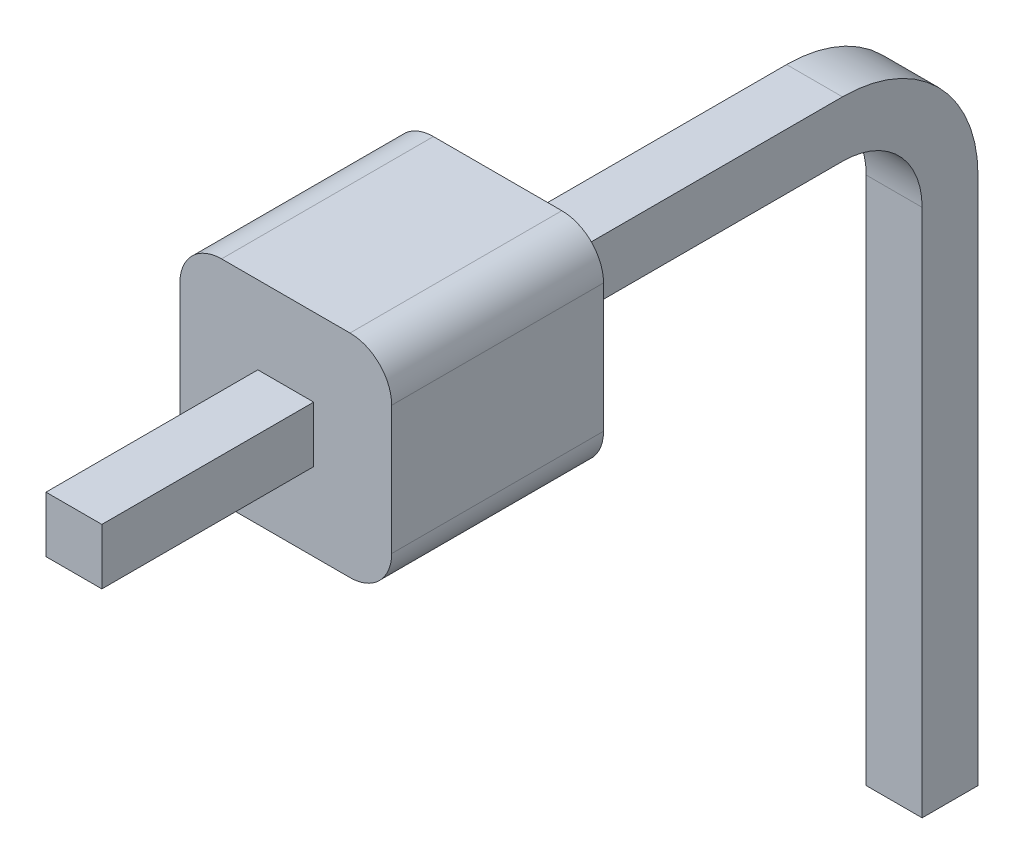
ISO-10303-21;
HEADER;
FILE_DESCRIPTION(('STEP AP214'),'2;1');
FILE_NAME('part.step','',(''),(''),'','','');
FILE_SCHEMA(('AUTOMOTIVE_DESIGN { 1 0 10303 214 1 1 1 1 }'));
ENDSEC;
DATA;
#1=APPLICATION_CONTEXT('core data for automotive mechanical design processes');
#2=APPLICATION_PROTOCOL_DEFINITION('international standard','automotive_design',2000,#1);
#3=PRODUCT_CONTEXT('',#1,'mechanical');
#4=PRODUCT('Part','Part','',(#3));
#5=PRODUCT_RELATED_PRODUCT_CATEGORY('part','',(#4));
#6=PRODUCT_DEFINITION_FORMATION('','',#4);
#7=PRODUCT_DEFINITION_CONTEXT('part definition',#1,'design');
#8=PRODUCT_DEFINITION('design','',#6,#7);
#9=PRODUCT_DEFINITION_SHAPE('','',#8);
#10=(LENGTH_UNIT() NAMED_UNIT(*) SI_UNIT(.MILLI.,.METRE.));
#11=(NAMED_UNIT(*) PLANE_ANGLE_UNIT() SI_UNIT($,.RADIAN.));
#12=(NAMED_UNIT(*) SI_UNIT($,.STERADIAN.) SOLID_ANGLE_UNIT());
#13=UNCERTAINTY_MEASURE_WITH_UNIT(LENGTH_MEASURE(1.E-05),#10,'distance_accuracy_value','');
#14=(GEOMETRIC_REPRESENTATION_CONTEXT(3) GLOBAL_UNCERTAINTY_ASSIGNED_CONTEXT((#13)) GLOBAL_UNIT_ASSIGNED_CONTEXT((#10,
#11,#12)) REPRESENTATION_CONTEXT('',''));
#15=CARTESIAN_POINT('',(0.,0.,0.));
#16=DIRECTION('',(0.,0.,1.));
#17=DIRECTION('',(1.,0.,0.));
#18=AXIS2_PLACEMENT_3D('',#15,#16,#17);
#19=CARTESIAN_POINT('',(-1.27,-0.0190907262086213,2.54));
#20=DIRECTION('',(0.,0.,1.));
#21=DIRECTION('',(1.,0.,0.));
#22=AXIS2_PLACEMENT_3D('',#19,#20,#21);
#23=PLANE('',#22);
#24=DIRECTION('',(1.,0.,0.));
#25=VECTOR('',#24,1.);
#26=CARTESIAN_POINT('',(-1.27,-2.55909072620862,2.54));
#27=LINE('',#26,#25);
#28=CARTESIAN_POINT('',(-0.769999999999999,-2.55909072620862,2.54));
#29=VERTEX_POINT('',#28);
#30=CARTESIAN_POINT('',(0.770000000000001,-2.55909072620862,2.54));
#31=VERTEX_POINT('',#30);
#32=EDGE_CURVE('E262',#29,#31,#27,.T.);
#33=ORIENTED_EDGE('',*,*,#32,.T.);
#34=CARTESIAN_POINT('',(0.770000000000001,-2.05909072620862,2.54));
#35=DIRECTION('',(0.,0.,1.));
#36=DIRECTION('',(1.,0.,0.));
#37=AXIS2_PLACEMENT_3D('',#34,#35,#36);
#38=CIRCLE('',#37,0.5);
#39=CARTESIAN_POINT('',(1.27,-2.05909072620862,2.54));
#40=VERTEX_POINT('',#39);
#41=EDGE_CURVE('E301',#31,#40,#38,.T.);
#42=ORIENTED_EDGE('',*,*,#41,.T.);
#43=DIRECTION('',(0.,1.,0.));
#44=VECTOR('',#43,1.);
#45=CARTESIAN_POINT('',(1.27,-0.019090726208621,2.54));
#46=LINE('',#45,#44);
#47=CARTESIAN_POINT('',(1.27,-0.519090726208621,2.54));
#48=VERTEX_POINT('',#47);
#49=EDGE_CURVE('E265',#40,#48,#46,.T.);
#50=ORIENTED_EDGE('',*,*,#49,.T.);
#51=CARTESIAN_POINT('',(0.770000000000001,-0.519090726208621,2.54));
#52=DIRECTION('',(0.,0.,1.));
#53=DIRECTION('',(1.,0.,0.));
#54=AXIS2_PLACEMENT_3D('',#51,#52,#53);
#55=CIRCLE('',#54,0.5);
#56=CARTESIAN_POINT('',(0.770000000000001,-0.019090726208621,2.54));
#57=VERTEX_POINT('',#56);
#58=EDGE_CURVE('E52',#48,#57,#55,.T.);
#59=ORIENTED_EDGE('',*,*,#58,.T.);
#60=DIRECTION('',(-1.,0.,0.));
#61=VECTOR('',#60,1.);
#62=CARTESIAN_POINT('',(-1.27,-0.0190907262086213,2.54));
#63=LINE('',#62,#61);
#64=CARTESIAN_POINT('',(-0.77,-0.0190907262086212,2.54));
#65=VERTEX_POINT('',#64);
#66=EDGE_CURVE('E267',#57,#65,#63,.T.);
#67=ORIENTED_EDGE('',*,*,#66,.T.);
#68=CARTESIAN_POINT('',(-0.769999999999999,-0.519090726208621,2.54));
#69=DIRECTION('',(0.,0.,1.));
#70=DIRECTION('',(1.,0.,0.));
#71=AXIS2_PLACEMENT_3D('',#68,#69,#70);
#72=CIRCLE('',#71,0.5);
#73=CARTESIAN_POINT('',(-1.27,-0.519090726208621,2.54));
#74=VERTEX_POINT('',#73);
#75=EDGE_CURVE('E297',#65,#74,#72,.T.);
#76=ORIENTED_EDGE('',*,*,#75,.T.);
#77=DIRECTION('',(0.,-1.,0.));
#78=VECTOR('',#77,1.);
#79=CARTESIAN_POINT('',(-1.27,-0.0190907262086213,2.54));
#80=LINE('',#79,#78);
#81=CARTESIAN_POINT('',(-1.27,-2.05909072620862,2.54));
#82=VERTEX_POINT('',#81);
#83=EDGE_CURVE('E259',#74,#82,#80,.T.);
#84=ORIENTED_EDGE('',*,*,#83,.T.);
#85=CARTESIAN_POINT('',(-0.769999999999999,-2.05909072620862,2.54));
#86=DIRECTION('',(0.,0.,1.));
#87=DIRECTION('',(1.,0.,0.));
#88=AXIS2_PLACEMENT_3D('',#85,#86,#87);
#89=CIRCLE('',#88,0.5);
#90=EDGE_CURVE('E299',#82,#29,#89,.T.);
#91=ORIENTED_EDGE('',*,*,#90,.T.);
#92=EDGE_LOOP('',(#33,#42,#50,#59,#67,#76,#84,#91));
#93=FACE_BOUND('',#92,.T.);
#94=DIRECTION('',(1.,0.,0.));
#95=VECTOR('',#94,1.);
#96=CARTESIAN_POINT('',(-1.27,-0.954090726208621,2.54));
#97=LINE('',#96,#95);
#98=CARTESIAN_POINT('',(-0.335,-0.954090726208621,2.54));
#99=VERTEX_POINT('',#98);
#100=CARTESIAN_POINT('',(0.335,-0.954090726208621,2.54));
#101=VERTEX_POINT('',#100);
#102=EDGE_CURVE('E236',#99,#101,#97,.T.);
#103=ORIENTED_EDGE('',*,*,#102,.T.);
#104=DIRECTION('',(0.,-1.,0.));
#105=VECTOR('',#104,1.);
#106=CARTESIAN_POINT('',(0.335000000000001,-0.0190907262086233,2.54));
#107=LINE('',#106,#105);
#108=CARTESIAN_POINT('',(0.334999999999999,-1.62409072620862,2.54));
#109=VERTEX_POINT('',#108);
#110=EDGE_CURVE('E245',#101,#109,#107,.T.);
#111=ORIENTED_EDGE('',*,*,#110,.T.);
#112=DIRECTION('',(-1.,0.,0.));
#113=VECTOR('',#112,1.);
#114=CARTESIAN_POINT('',(-1.27,-1.62409072620862,2.54));
#115=LINE('',#114,#113);
#116=CARTESIAN_POINT('',(-0.335,-1.62409072620862,2.54));
#117=VERTEX_POINT('',#116);
#118=EDGE_CURVE('E242',#109,#117,#115,.T.);
#119=ORIENTED_EDGE('',*,*,#118,.T.);
#120=DIRECTION('',(0.,1.,0.));
#121=VECTOR('',#120,1.);
#122=CARTESIAN_POINT('',(-0.335,-0.0190907262086213,2.54));
#123=LINE('',#122,#121);
#124=EDGE_CURVE('E239',#117,#99,#123,.T.);
#125=ORIENTED_EDGE('',*,*,#124,.T.);
#126=EDGE_LOOP('',(#103,#111,#119,#125));
#127=FACE_BOUND('',#126,.T.);
#128=ADVANCED_FACE('F32',(#93,#127),#23,.T.);
#129=CARTESIAN_POINT('',(-1.27,-0.0190907262086213,0.));
#130=DIRECTION('',(0.,0.,1.));
#131=DIRECTION('',(1.,0.,0.));
#132=AXIS2_PLACEMENT_3D('',#129,#130,#131);
#133=PLANE('',#132);
#134=DIRECTION('',(0.,1.,0.));
#135=VECTOR('',#134,1.);
#136=CARTESIAN_POINT('',(1.27,-0.019090726208621,0.));
#137=LINE('',#136,#135);
#138=CARTESIAN_POINT('',(1.27,-2.05909072620862,0.));
#139=VERTEX_POINT('',#138);
#140=CARTESIAN_POINT('',(1.27,-0.519090726208621,0.));
#141=VERTEX_POINT('',#140);
#142=EDGE_CURVE('E254',#139,#141,#137,.T.);
#143=ORIENTED_EDGE('',*,*,#142,.F.);
#144=CARTESIAN_POINT('',(0.770000000000001,-2.05909072620862,0.));
#145=DIRECTION('',(0.,0.,1.));
#146=DIRECTION('',(1.,0.,0.));
#147=AXIS2_PLACEMENT_3D('',#144,#145,#146);
#148=CIRCLE('',#147,0.5);
#149=CARTESIAN_POINT('',(0.770000000000001,-2.55909072620862,0.));
#150=VERTEX_POINT('',#149);
#151=EDGE_CURVE('E289',#139,#150,#148,.F.);
#152=ORIENTED_EDGE('',*,*,#151,.T.);
#153=DIRECTION('',(1.,0.,0.));
#154=VECTOR('',#153,1.);
#155=CARTESIAN_POINT('',(-1.27,-2.55909072620862,0.));
#156=LINE('',#155,#154);
#157=CARTESIAN_POINT('',(-0.769999999999999,-2.55909072620862,0.));
#158=VERTEX_POINT('',#157);
#159=EDGE_CURVE('E251',#158,#150,#156,.T.);
#160=ORIENTED_EDGE('',*,*,#159,.F.);
#161=CARTESIAN_POINT('',(-0.769999999999999,-2.05909072620862,0.));
#162=DIRECTION('',(0.,0.,1.));
#163=DIRECTION('',(1.,0.,0.));
#164=AXIS2_PLACEMENT_3D('',#161,#162,#163);
#165=CIRCLE('',#164,0.5);
#166=CARTESIAN_POINT('',(-1.27,-2.05909072620862,0.));
#167=VERTEX_POINT('',#166);
#168=EDGE_CURVE('E287',#158,#167,#165,.F.);
#169=ORIENTED_EDGE('',*,*,#168,.T.);
#170=DIRECTION('',(0.,-1.,0.));
#171=VECTOR('',#170,1.);
#172=CARTESIAN_POINT('',(-1.27,-0.0190907262086213,0.));
#173=LINE('',#172,#171);
#174=CARTESIAN_POINT('',(-1.27,-0.519090726208621,0.));
#175=VERTEX_POINT('',#174);
#176=EDGE_CURVE('E248',#175,#167,#173,.T.);
#177=ORIENTED_EDGE('',*,*,#176,.F.);
#178=CARTESIAN_POINT('',(-0.769999999999999,-0.519090726208621,0.));
#179=DIRECTION('',(0.,0.,1.));
#180=DIRECTION('',(1.,0.,0.));
#181=AXIS2_PLACEMENT_3D('',#178,#179,#180);
#182=CIRCLE('',#181,0.5);
#183=CARTESIAN_POINT('',(-0.77,-0.0190907262086212,0.));
#184=VERTEX_POINT('',#183);
#185=EDGE_CURVE('E285',#175,#184,#182,.F.);
#186=ORIENTED_EDGE('',*,*,#185,.T.);
#187=DIRECTION('',(-1.,0.,0.));
#188=VECTOR('',#187,1.);
#189=CARTESIAN_POINT('',(-1.27,-0.0190907262086213,0.));
#190=LINE('',#189,#188);
#191=CARTESIAN_POINT('',(0.770000000000001,-0.019090726208621,0.));
#192=VERTEX_POINT('',#191);
#193=EDGE_CURVE('E257',#192,#184,#190,.T.);
#194=ORIENTED_EDGE('',*,*,#193,.F.);
#195=CARTESIAN_POINT('',(0.770000000000001,-0.519090726208621,0.));
#196=DIRECTION('',(0.,0.,1.));
#197=DIRECTION('',(1.,0.,0.));
#198=AXIS2_PLACEMENT_3D('',#195,#196,#197);
#199=CIRCLE('',#198,0.5);
#200=EDGE_CURVE('E283',#192,#141,#199,.F.);
#201=ORIENTED_EDGE('',*,*,#200,.T.);
#202=EDGE_LOOP('',(#143,#152,#160,#169,#177,#186,#194,#201));
#203=FACE_BOUND('',#202,.T.);
#204=DIRECTION('',(0.,-1.,0.));
#205=VECTOR('',#204,1.);
#206=CARTESIAN_POINT('',(0.335000000000001,-0.0190907262086233,0.));
#207=LINE('',#206,#205);
#208=CARTESIAN_POINT('',(0.335,-0.954090726208621,0.));
#209=VERTEX_POINT('',#208);
#210=CARTESIAN_POINT('',(0.334999999999999,-1.62409072620862,0.));
#211=VERTEX_POINT('',#210);
#212=EDGE_CURVE('E197',#209,#211,#207,.T.);
#213=ORIENTED_EDGE('',*,*,#212,.F.);
#214=DIRECTION('',(1.,0.,0.));
#215=VECTOR('',#214,1.);
#216=CARTESIAN_POINT('',(-1.27,-0.95409072620862,0.));
#217=LINE('',#216,#215);
#218=CARTESIAN_POINT('',(-0.335,-0.954090726208621,0.));
#219=VERTEX_POINT('',#218);
#220=EDGE_CURVE('E269',#219,#209,#217,.T.);
#221=ORIENTED_EDGE('',*,*,#220,.F.);
#222=DIRECTION('',(0.,1.,0.));
#223=VECTOR('',#222,1.);
#224=CARTESIAN_POINT('',(-0.335,-0.0190907262086213,0.));
#225=LINE('',#224,#223);
#226=CARTESIAN_POINT('',(-0.335,-1.62409072620862,0.));
#227=VERTEX_POINT('',#226);
#228=EDGE_CURVE('E272',#227,#219,#225,.T.);
#229=ORIENTED_EDGE('',*,*,#228,.F.);
#230=DIRECTION('',(-1.,0.,0.));
#231=VECTOR('',#230,1.);
#232=CARTESIAN_POINT('',(-1.27,-1.62409072620862,0.));
#233=LINE('',#232,#231);
#234=EDGE_CURVE('E275',#211,#227,#233,.T.);
#235=ORIENTED_EDGE('',*,*,#234,.F.);
#236=EDGE_LOOP('',(#213,#221,#229,#235));
#237=FACE_BOUND('',#236,.T.);
#238=ADVANCED_FACE('F314',(#203,#237),#133,.F.);
#239=CARTESIAN_POINT('',(-1.27,-0.0190907262086213,2.54));
#240=DIRECTION('',(1.,0.,0.));
#241=DIRECTION('',(0.,0.,-1.));
#242=AXIS2_PLACEMENT_3D('',#239,#240,#241);
#243=PLANE('',#242);
#244=ORIENTED_EDGE('',*,*,#176,.T.);
#245=DIRECTION('',(0.,0.,-1.));
#246=VECTOR('',#245,1.);
#247=CARTESIAN_POINT('',(-1.27,-2.05909072620862,2.54));
#248=LINE('',#247,#246);
#249=EDGE_CURVE('E306',#167,#82,#248,.F.);
#250=ORIENTED_EDGE('',*,*,#249,.T.);
#251=ORIENTED_EDGE('',*,*,#83,.F.);
#252=DIRECTION('',(0.,0.,-1.));
#253=VECTOR('',#252,1.);
#254=CARTESIAN_POINT('',(-1.27,-0.519090726208621,2.54));
#255=LINE('',#254,#253);
#256=EDGE_CURVE('E303',#74,#175,#255,.T.);
#257=ORIENTED_EDGE('',*,*,#256,.T.);
#258=EDGE_LOOP('',(#244,#250,#251,#257));
#259=FACE_BOUND('',#258,.T.);
#260=ADVANCED_FACE('F323',(#259),#243,.F.);
#261=CARTESIAN_POINT('',(-1.27,-2.55909072620862,2.54));
#262=DIRECTION('',(0.,1.,0.));
#263=DIRECTION('',(-1.,0.,0.));
#264=AXIS2_PLACEMENT_3D('',#261,#262,#263);
#265=PLANE('',#264);
#266=ORIENTED_EDGE('',*,*,#159,.T.);
#267=DIRECTION('',(0.,0.,-1.));
#268=VECTOR('',#267,1.);
#269=CARTESIAN_POINT('',(0.770000000000001,-2.55909072620862,2.54));
#270=LINE('',#269,#268);
#271=EDGE_CURVE('E294',#150,#31,#270,.F.);
#272=ORIENTED_EDGE('',*,*,#271,.T.);
#273=ORIENTED_EDGE('',*,*,#32,.F.);
#274=DIRECTION('',(0.,0.,-1.));
#275=VECTOR('',#274,1.);
#276=CARTESIAN_POINT('',(-0.769999999999999,-2.55909072620862,2.54));
#277=LINE('',#276,#275);
#278=EDGE_CURVE('E291',#29,#158,#277,.T.);
#279=ORIENTED_EDGE('',*,*,#278,.T.);
#280=EDGE_LOOP('',(#266,#272,#273,#279));
#281=FACE_BOUND('',#280,.T.);
#282=ADVANCED_FACE('F333',(#281),#265,.F.);
#283=CARTESIAN_POINT('',(1.27,-0.019090726208621,2.54));
#284=DIRECTION('',(-1.,0.,0.));
#285=DIRECTION('',(0.,0.,1.));
#286=AXIS2_PLACEMENT_3D('',#283,#284,#285);
#287=PLANE('',#286);
#288=ORIENTED_EDGE('',*,*,#49,.F.);
#289=DIRECTION('',(0.,0.,-1.));
#290=VECTOR('',#289,1.);
#291=CARTESIAN_POINT('',(1.27,-2.05909072620862,2.54));
#292=LINE('',#291,#290);
#293=EDGE_CURVE('E280',#40,#139,#292,.T.);
#294=ORIENTED_EDGE('',*,*,#293,.T.);
#295=ORIENTED_EDGE('',*,*,#142,.T.);
#296=DIRECTION('',(0.,0.,-1.));
#297=VECTOR('',#296,1.);
#298=CARTESIAN_POINT('',(1.27,-0.519090726208621,2.54));
#299=LINE('',#298,#297);
#300=EDGE_CURVE('E278',#141,#48,#299,.F.);
#301=ORIENTED_EDGE('',*,*,#300,.T.);
#302=EDGE_LOOP('',(#288,#294,#295,#301));
#303=FACE_BOUND('',#302,.T.);
#304=ADVANCED_FACE('F341',(#303),#287,.F.);
#305=CARTESIAN_POINT('',(-1.27,-0.0190907262086213,2.54));
#306=DIRECTION('',(0.,-1.,0.));
#307=DIRECTION('',(1.,0.,0.));
#308=AXIS2_PLACEMENT_3D('',#305,#306,#307);
#309=PLANE('',#308);
#310=ORIENTED_EDGE('',*,*,#193,.T.);
#311=DIRECTION('',(0.,0.,-1.));
#312=VECTOR('',#311,1.);
#313=CARTESIAN_POINT('',(-0.77,-0.0190907262086212,2.54));
#314=LINE('',#313,#312);
#315=EDGE_CURVE('E11',#184,#65,#314,.F.);
#316=ORIENTED_EDGE('',*,*,#315,.T.);
#317=ORIENTED_EDGE('',*,*,#66,.F.);
#318=DIRECTION('',(0.,0.,-1.));
#319=VECTOR('',#318,1.);
#320=CARTESIAN_POINT('',(0.770000000000001,-0.019090726208621,2.54));
#321=LINE('',#320,#319);
#322=EDGE_CURVE('E40',#57,#192,#321,.T.);
#323=ORIENTED_EDGE('',*,*,#322,.T.);
#324=EDGE_LOOP('',(#310,#316,#317,#323));
#325=FACE_BOUND('',#324,.T.);
#326=ADVANCED_FACE('F310',(#325),#309,.F.);
#327=CARTESIAN_POINT('',(0.,-2.57909072620862,-3.8));
#328=DIRECTION('',(-1.,0.,0.));
#329=DIRECTION('',(0.,0.,1.));
#330=AXIS2_PLACEMENT_3D('',#327,#328,#329);
#331=CYLINDRICAL_SURFACE('',#330,0.955000000000001);
#332=DIRECTION('',(-1.,0.,0.));
#333=VECTOR('',#332,1.);
#334=CARTESIAN_POINT('',(0.334999999999999,-1.62409072620862,-3.8));
#335=LINE('',#334,#333);
#336=CARTESIAN_POINT('',(0.334999999999999,-1.62409072620862,-3.8));
#337=VERTEX_POINT('',#336);
#338=CARTESIAN_POINT('',(-0.335,-1.62409072620862,-3.8));
#339=VERTEX_POINT('',#338);
#340=EDGE_CURVE('E174',#337,#339,#335,.T.);
#341=ORIENTED_EDGE('',*,*,#340,.T.);
#342=CARTESIAN_POINT('',(-0.335,-2.57909072620862,-3.8));
#343=DIRECTION('',(-1.,0.,0.));
#344=DIRECTION('',(0.,0.,1.));
#345=AXIS2_PLACEMENT_3D('',#342,#343,#344);
#346=CIRCLE('',#345,0.955000000000001);
#347=CARTESIAN_POINT('',(-0.335,-2.57909072620862,-4.755));
#348=VERTEX_POINT('',#347);
#349=EDGE_CURVE('E182',#339,#348,#346,.T.);
#350=ORIENTED_EDGE('',*,*,#349,.T.);
#351=DIRECTION('',(-1.,0.,0.));
#352=VECTOR('',#351,1.);
#353=CARTESIAN_POINT('',(0.334999999999999,-2.57909072620862,-4.755));
#354=LINE('',#353,#352);
#355=CARTESIAN_POINT('',(0.334999999999999,-2.57909072620862,-4.755));
#356=VERTEX_POINT('',#355);
#357=EDGE_CURVE('E177',#356,#348,#354,.T.);
#358=ORIENTED_EDGE('',*,*,#357,.F.);
#359=CARTESIAN_POINT('',(0.334999999999999,-2.57909072620862,-3.8));
#360=DIRECTION('',(-1.,0.,0.));
#361=DIRECTION('',(0.,0.,1.));
#362=AXIS2_PLACEMENT_3D('',#359,#360,#361);
#363=CIRCLE('',#362,0.955000000000001);
#364=EDGE_CURVE('E170',#337,#356,#363,.T.);
#365=ORIENTED_EDGE('',*,*,#364,.F.);
#366=EDGE_LOOP('',(#341,#350,#358,#365));
#367=FACE_BOUND('',#366,.T.);
#368=ADVANCED_FACE('F172',(#367),#331,.F.);
#369=CARTESIAN_POINT('',(0.334999999999999,-2.57909072620862,-4.755));
#370=DIRECTION('',(0.,0.,1.));
#371=DIRECTION('',(0.,-1.,0.));
#372=AXIS2_PLACEMENT_3D('',#369,#370,#371);
#373=PLANE('',#372);
#374=ORIENTED_EDGE('',*,*,#357,.T.);
#375=DIRECTION('',(0.,-1.,0.));
#376=VECTOR('',#375,1.);
#377=CARTESIAN_POINT('',(-0.335,-2.57909072620862,-4.755));
#378=LINE('',#377,#376);
#379=CARTESIAN_POINT('',(-0.335,-8.91909072620862,-4.755));
#380=VERTEX_POINT('',#379);
#381=EDGE_CURVE('E231',#348,#380,#378,.T.);
#382=ORIENTED_EDGE('',*,*,#381,.T.);
#383=DIRECTION('',(-1.,0.,0.));
#384=VECTOR('',#383,1.);
#385=CARTESIAN_POINT('',(0.334999999999999,-8.91909072620862,-4.755));
#386=LINE('',#385,#384);
#387=CARTESIAN_POINT('',(0.334999999999999,-8.91909072620862,-4.755));
#388=VERTEX_POINT('',#387);
#389=EDGE_CURVE('E222',#388,#380,#386,.T.);
#390=ORIENTED_EDGE('',*,*,#389,.F.);
#391=DIRECTION('',(0.,-1.,0.));
#392=VECTOR('',#391,1.);
#393=CARTESIAN_POINT('',(0.334999999999999,-2.57909072620862,-4.755));
#394=LINE('',#393,#392);
#395=EDGE_CURVE('E234',#356,#388,#394,.T.);
#396=ORIENTED_EDGE('',*,*,#395,.F.);
#397=EDGE_LOOP('',(#374,#382,#390,#396));
#398=FACE_BOUND('',#397,.T.);
#399=ADVANCED_FACE('F505',(#398),#373,.T.);
#400=CARTESIAN_POINT('',(0.335,-8.91909072620862,-5.425));
#401=DIRECTION('',(0.,-1.,0.));
#402=DIRECTION('',(-1.,0.,0.));
#403=AXIS2_PLACEMENT_3D('',#400,#401,#402);
#404=PLANE('',#403);
#405=DIRECTION('',(0.,0.,1.));
#406=VECTOR('',#405,1.);
#407=CARTESIAN_POINT('',(0.335,-8.91909072620862,-5.425));
#408=LINE('',#407,#406);
#409=CARTESIAN_POINT('',(0.335,-8.91909072620862,-5.425));
#410=VERTEX_POINT('',#409);
#411=EDGE_CURVE('E181',#410,#388,#408,.T.);
#412=ORIENTED_EDGE('',*,*,#411,.T.);
#413=ORIENTED_EDGE('',*,*,#389,.T.);
#414=DIRECTION('',(0.,0.,-1.));
#415=VECTOR('',#414,1.);
#416=CARTESIAN_POINT('',(-0.335,-8.91909072620862,-5.425));
#417=LINE('',#416,#415);
#418=CARTESIAN_POINT('',(-0.335,-8.91909072620862,-5.425));
#419=VERTEX_POINT('',#418);
#420=EDGE_CURVE('E219',#380,#419,#417,.T.);
#421=ORIENTED_EDGE('',*,*,#420,.T.);
#422=DIRECTION('',(1.,0.,0.));
#423=VECTOR('',#422,1.);
#424=CARTESIAN_POINT('',(0.335,-8.91909072620862,-5.425));
#425=LINE('',#424,#423);
#426=EDGE_CURVE('E216',#419,#410,#425,.T.);
#427=ORIENTED_EDGE('',*,*,#426,.T.);
#428=EDGE_LOOP('',(#412,#413,#421,#427));
#429=FACE_BOUND('',#428,.T.);
#430=ADVANCED_FACE('F495',(#429),#404,.T.);
#431=CARTESIAN_POINT('',(0.335,-2.57909072620862,-5.425));
#432=DIRECTION('',(0.,0.,-1.));
#433=DIRECTION('',(-1.,0.,0.));
#434=AXIS2_PLACEMENT_3D('',#431,#432,#433);
#435=PLANE('',#434);
#436=DIRECTION('',(1.,0.,0.));
#437=VECTOR('',#436,1.);
#438=CARTESIAN_POINT('',(0.335,-2.57909072620862,-5.425));
#439=LINE('',#438,#437);
#440=CARTESIAN_POINT('',(-0.335,-2.57909072620862,-5.425));
#441=VERTEX_POINT('',#440);
#442=CARTESIAN_POINT('',(0.335,-2.57909072620862,-5.425));
#443=VERTEX_POINT('',#442);
#444=EDGE_CURVE('E198',#441,#443,#439,.T.);
#445=ORIENTED_EDGE('',*,*,#444,.T.);
#446=DIRECTION('',(0.,-1.,0.));
#447=VECTOR('',#446,1.);
#448=CARTESIAN_POINT('',(0.335,-2.57909072620862,-5.425));
#449=LINE('',#448,#447);
#450=EDGE_CURVE('E225',#443,#410,#449,.T.);
#451=ORIENTED_EDGE('',*,*,#450,.T.);
#452=ORIENTED_EDGE('',*,*,#426,.F.);
#453=DIRECTION('',(0.,-1.,0.));
#454=VECTOR('',#453,1.);
#455=CARTESIAN_POINT('',(-0.335,-2.57909072620862,-5.425));
#456=LINE('',#455,#454);
#457=EDGE_CURVE('E228',#441,#419,#456,.T.);
#458=ORIENTED_EDGE('',*,*,#457,.F.);
#459=EDGE_LOOP('',(#445,#451,#452,#458));
#460=FACE_BOUND('',#459,.T.);
#461=ADVANCED_FACE('F485',(#460),#435,.T.);
#462=CARTESIAN_POINT('',(0.,-2.57909072620862,-3.8));
#463=DIRECTION('',(-1.,0.,0.));
#464=DIRECTION('',(0.,0.,1.));
#465=AXIS2_PLACEMENT_3D('',#462,#463,#464);
#466=CYLINDRICAL_SURFACE('',#465,1.625);
#467=DIRECTION('',(1.,0.,0.));
#468=VECTOR('',#467,1.);
#469=CARTESIAN_POINT('',(0.335,-0.95409072620862,-3.8));
#470=LINE('',#469,#468);
#471=CARTESIAN_POINT('',(-0.335,-0.95409072620862,-3.8));
#472=VERTEX_POINT('',#471);
#473=CARTESIAN_POINT('',(0.335,-0.95409072620862,-3.8));
#474=VERTEX_POINT('',#473);
#475=EDGE_CURVE('E191',#472,#474,#470,.T.);
#476=ORIENTED_EDGE('',*,*,#475,.T.);
#477=CARTESIAN_POINT('',(0.335,-2.57909072620862,-3.8));
#478=DIRECTION('',(-1.,0.,0.));
#479=DIRECTION('',(0.,0.,1.));
#480=AXIS2_PLACEMENT_3D('',#477,#478,#479);
#481=CIRCLE('',#480,1.625);
#482=EDGE_CURVE('E207',#474,#443,#481,.T.);
#483=ORIENTED_EDGE('',*,*,#482,.T.);
#484=ORIENTED_EDGE('',*,*,#444,.F.);
#485=CARTESIAN_POINT('',(-0.335,-2.57909072620862,-3.8));
#486=DIRECTION('',(-1.,0.,0.));
#487=DIRECTION('',(0.,0.,1.));
#488=AXIS2_PLACEMENT_3D('',#485,#486,#487);
#489=CIRCLE('',#488,1.625);
#490=EDGE_CURVE('E210',#472,#441,#489,.T.);
#491=ORIENTED_EDGE('',*,*,#490,.F.);
#492=EDGE_LOOP('',(#476,#483,#484,#491));
#493=FACE_BOUND('',#492,.T.);
#494=ADVANCED_FACE('F475',(#493),#466,.T.);
#495=CARTESIAN_POINT('',(0.335,-0.95409072620862,-3.8));
#496=DIRECTION('',(0.,-1.,0.));
#497=DIRECTION('',(1.,0.,0.));
#498=AXIS2_PLACEMENT_3D('',#495,#496,#497);
#499=PLANE('',#498);
#500=DIRECTION('',(0.,0.,1.));
#501=VECTOR('',#500,1.);
#502=CARTESIAN_POINT('',(-0.335,-0.95409072620862,-3.8));
#503=LINE('',#502,#501);
#504=EDGE_CURVE('E570',#472,#219,#503,.T.);
#505=ORIENTED_EDGE('',*,*,#504,.T.);
#506=ORIENTED_EDGE('',*,*,#220,.T.);
#507=DIRECTION('',(0.,0.,1.));
#508=VECTOR('',#507,1.);
#509=CARTESIAN_POINT('',(0.335,-0.95409072620862,-3.8));
#510=LINE('',#509,#508);
#511=EDGE_CURVE('E567',#474,#209,#510,.T.);
#512=ORIENTED_EDGE('',*,*,#511,.F.);
#513=ORIENTED_EDGE('',*,*,#475,.F.);
#514=EDGE_LOOP('',(#505,#506,#512,#513));
#515=FACE_BOUND('',#514,.T.);
#516=ADVANCED_FACE('F408',(#515),#499,.F.);
#517=CARTESIAN_POINT('',(-0.335,-0.95409072620862,-3.8));
#518=DIRECTION('',(1.,0.,0.));
#519=DIRECTION('',(0.,0.,-1.));
#520=AXIS2_PLACEMENT_3D('',#517,#518,#519);
#521=PLANE('',#520);
#522=DIRECTION('',(0.,0.,1.));
#523=VECTOR('',#522,1.);
#524=CARTESIAN_POINT('',(-0.335,-1.62409072620862,-3.8));
#525=LINE('',#524,#523);
#526=EDGE_CURVE('E190',#339,#227,#525,.T.);
#527=ORIENTED_EDGE('',*,*,#526,.T.);
#528=ORIENTED_EDGE('',*,*,#228,.T.);
#529=ORIENTED_EDGE('',*,*,#504,.F.);
#530=ORIENTED_EDGE('',*,*,#490,.T.);
#531=ORIENTED_EDGE('',*,*,#457,.T.);
#532=ORIENTED_EDGE('',*,*,#420,.F.);
#533=ORIENTED_EDGE('',*,*,#381,.F.);
#534=ORIENTED_EDGE('',*,*,#349,.F.);
#535=EDGE_LOOP('',(#527,#528,#529,#530,#531,#532,#533,#534));
#536=FACE_BOUND('',#535,.T.);
#537=ADVANCED_FACE('F418',(#536),#521,.F.);
#538=CARTESIAN_POINT('',(0.334999999999999,-1.62409072620862,-3.8));
#539=DIRECTION('',(0.,1.,0.));
#540=DIRECTION('',(0.,0.,1.));
#541=AXIS2_PLACEMENT_3D('',#538,#539,#540);
#542=PLANE('',#541);
#543=DIRECTION('',(0.,0.,1.));
#544=VECTOR('',#543,1.);
#545=CARTESIAN_POINT('',(0.334999999999999,-1.62409072620862,-3.8));
#546=LINE('',#545,#544);
#547=EDGE_CURVE('E188',#337,#211,#546,.T.);
#548=ORIENTED_EDGE('',*,*,#547,.T.);
#549=ORIENTED_EDGE('',*,*,#234,.T.);
#550=ORIENTED_EDGE('',*,*,#526,.F.);
#551=ORIENTED_EDGE('',*,*,#340,.F.);
#552=EDGE_LOOP('',(#548,#549,#550,#551));
#553=FACE_BOUND('',#552,.T.);
#554=ADVANCED_FACE('F186',(#553),#542,.F.);
#555=CARTESIAN_POINT('',(0.335,-0.95409072620862,-3.8));
#556=DIRECTION('',(-1.,0.,0.));
#557=DIRECTION('',(0.,-1.,0.));
#558=AXIS2_PLACEMENT_3D('',#555,#556,#557);
#559=PLANE('',#558);
#560=ORIENTED_EDGE('',*,*,#511,.T.);
#561=ORIENTED_EDGE('',*,*,#212,.T.);
#562=ORIENTED_EDGE('',*,*,#547,.F.);
#563=ORIENTED_EDGE('',*,*,#364,.T.);
#564=ORIENTED_EDGE('',*,*,#395,.T.);
#565=ORIENTED_EDGE('',*,*,#411,.F.);
#566=ORIENTED_EDGE('',*,*,#450,.F.);
#567=ORIENTED_EDGE('',*,*,#482,.F.);
#568=EDGE_LOOP('',(#560,#561,#562,#563,#564,#565,#566,#567));
#569=FACE_BOUND('',#568,.T.);
#570=ADVANCED_FACE('F196',(#569),#559,.F.);
#571=ORIENTED_EDGE('',*,*,#110,.F.);
#572=CARTESIAN_POINT('',(0.335,-0.954090726208622,5.08));
#573=VERTEX_POINT('',#572);
#574=EDGE_CURVE('E565',#101,#573,#510,.T.);
#575=ORIENTED_EDGE('',*,*,#574,.T.);
#576=DIRECTION('',(0.,-1.,0.));
#577=VECTOR('',#576,1.);
#578=CARTESIAN_POINT('',(0.335,-0.954090726208622,5.08));
#579=LINE('',#578,#577);
#580=CARTESIAN_POINT('',(0.334999999999999,-1.62409072620862,5.08));
#581=VERTEX_POINT('',#580);
#582=EDGE_CURVE('E586',#573,#581,#579,.T.);
#583=ORIENTED_EDGE('',*,*,#582,.T.);
#584=EDGE_CURVE('E199',#109,#581,#546,.T.);
#585=ORIENTED_EDGE('',*,*,#584,.F.);
#586=EDGE_LOOP('',(#571,#575,#583,#585));
#587=FACE_BOUND('',#586,.T.);
#588=ADVANCED_FACE('F429',(#587),#559,.F.);
#589=ORIENTED_EDGE('',*,*,#118,.F.);
#590=ORIENTED_EDGE('',*,*,#584,.T.);
#591=DIRECTION('',(-1.,0.,0.));
#592=VECTOR('',#591,1.);
#593=CARTESIAN_POINT('',(0.334999999999999,-1.62409072620862,5.08));
#594=LINE('',#593,#592);
#595=CARTESIAN_POINT('',(-0.335,-1.62409072620862,5.08));
#596=VERTEX_POINT('',#595);
#597=EDGE_CURVE('E582',#581,#596,#594,.T.);
#598=ORIENTED_EDGE('',*,*,#597,.T.);
#599=EDGE_CURVE('E573',#117,#596,#525,.T.);
#600=ORIENTED_EDGE('',*,*,#599,.F.);
#601=EDGE_LOOP('',(#589,#590,#598,#600));
#602=FACE_BOUND('',#601,.T.);
#603=ADVANCED_FACE('F415',(#602),#542,.F.);
#604=ORIENTED_EDGE('',*,*,#124,.F.);
#605=ORIENTED_EDGE('',*,*,#599,.T.);
#606=DIRECTION('',(0.,1.,0.));
#607=VECTOR('',#606,1.);
#608=CARTESIAN_POINT('',(-0.335,-0.954090726208621,5.08));
#609=LINE('',#608,#607);
#610=CARTESIAN_POINT('',(-0.335,-0.954090726208621,5.08));
#611=VERTEX_POINT('',#610);
#612=EDGE_CURVE('E579',#596,#611,#609,.T.);
#613=ORIENTED_EDGE('',*,*,#612,.T.);
#614=EDGE_CURVE('E568',#99,#611,#503,.T.);
#615=ORIENTED_EDGE('',*,*,#614,.F.);
#616=EDGE_LOOP('',(#604,#605,#613,#615));
#617=FACE_BOUND('',#616,.T.);
#618=ADVANCED_FACE('F405',(#617),#521,.F.);
#619=ORIENTED_EDGE('',*,*,#102,.F.);
#620=ORIENTED_EDGE('',*,*,#614,.T.);
#621=DIRECTION('',(1.,0.,0.));
#622=VECTOR('',#621,1.);
#623=CARTESIAN_POINT('',(0.335,-0.954090726208622,5.08));
#624=LINE('',#623,#622);
#625=EDGE_CURVE('E192',#611,#573,#624,.T.);
#626=ORIENTED_EDGE('',*,*,#625,.T.);
#627=ORIENTED_EDGE('',*,*,#574,.F.);
#628=EDGE_LOOP('',(#619,#620,#626,#627));
#629=FACE_BOUND('',#628,.T.);
#630=ADVANCED_FACE('F396',(#629),#499,.F.);
#631=CARTESIAN_POINT('',(0.335,-0.954090726208622,5.08));
#632=DIRECTION('',(0.,0.,-1.));
#633=DIRECTION('',(-1.,0.,0.));
#634=AXIS2_PLACEMENT_3D('',#631,#632,#633);
#635=PLANE('',#634);
#636=ORIENTED_EDGE('',*,*,#582,.F.);
#637=ORIENTED_EDGE('',*,*,#625,.F.);
#638=ORIENTED_EDGE('',*,*,#612,.F.);
#639=ORIENTED_EDGE('',*,*,#597,.F.);
#640=EDGE_LOOP('',(#636,#637,#638,#639));
#641=FACE_BOUND('',#640,.T.);
#642=ADVANCED_FACE('F365',(#641),#635,.F.);
#643=CARTESIAN_POINT('',(0.770000000000001,-2.05909072620862,2.54));
#644=DIRECTION('',(0.,0.,-1.));
#645=DIRECTION('',(-1.,0.,0.));
#646=AXIS2_PLACEMENT_3D('',#643,#644,#645);
#647=CYLINDRICAL_SURFACE('',#646,0.5);
#648=ORIENTED_EDGE('',*,*,#41,.F.);
#649=ORIENTED_EDGE('',*,*,#271,.F.);
#650=ORIENTED_EDGE('',*,*,#151,.F.);
#651=ORIENTED_EDGE('',*,*,#293,.F.);
#652=EDGE_LOOP('',(#648,#649,#650,#651));
#653=FACE_BOUND('',#652,.T.);
#654=ADVANCED_FACE('F338',(#653),#647,.T.);
#655=CARTESIAN_POINT('',(-0.769999999999999,-2.05909072620862,2.54));
#656=DIRECTION('',(0.,0.,-1.));
#657=DIRECTION('',(-1.,0.,0.));
#658=AXIS2_PLACEMENT_3D('',#655,#656,#657);
#659=CYLINDRICAL_SURFACE('',#658,0.5);
#660=ORIENTED_EDGE('',*,*,#90,.F.);
#661=ORIENTED_EDGE('',*,*,#249,.F.);
#662=ORIENTED_EDGE('',*,*,#168,.F.);
#663=ORIENTED_EDGE('',*,*,#278,.F.);
#664=EDGE_LOOP('',(#660,#661,#662,#663));
#665=FACE_BOUND('',#664,.T.);
#666=ADVANCED_FACE('F330',(#665),#659,.T.);
#667=CARTESIAN_POINT('',(-0.769999999999999,-0.519090726208621,2.54));
#668=DIRECTION('',(0.,0.,-1.));
#669=DIRECTION('',(-1.,0.,0.));
#670=AXIS2_PLACEMENT_3D('',#667,#668,#669);
#671=CYLINDRICAL_SURFACE('',#670,0.5);
#672=ORIENTED_EDGE('',*,*,#75,.F.);
#673=ORIENTED_EDGE('',*,*,#315,.F.);
#674=ORIENTED_EDGE('',*,*,#185,.F.);
#675=ORIENTED_EDGE('',*,*,#256,.F.);
#676=EDGE_LOOP('',(#672,#673,#674,#675));
#677=FACE_BOUND('',#676,.T.);
#678=ADVANCED_FACE('F320',(#677),#671,.T.);
#679=CARTESIAN_POINT('',(0.770000000000001,-0.519090726208621,2.54));
#680=DIRECTION('',(0.,0.,-1.));
#681=DIRECTION('',(-1.,0.,0.));
#682=AXIS2_PLACEMENT_3D('',#679,#680,#681);
#683=CYLINDRICAL_SURFACE('',#682,0.5);
#684=ORIENTED_EDGE('',*,*,#58,.F.);
#685=ORIENTED_EDGE('',*,*,#300,.F.);
#686=ORIENTED_EDGE('',*,*,#200,.F.);
#687=ORIENTED_EDGE('',*,*,#322,.F.);
#688=EDGE_LOOP('',(#684,#685,#686,#687));
#689=FACE_BOUND('',#688,.T.);
#690=ADVANCED_FACE('F34',(#689),#683,.T.);
#691=CLOSED_SHELL('',(#128,#238,#260,#282,#304,#326,#368,#399,#430,#461,#494,#516,#537,#554,
#570,#588,#603,#618,#630,#642,#654,#666,#678,#690));
#692=MANIFOLD_SOLID_BREP('B2',#691);
#693=ADVANCED_BREP_SHAPE_REPRESENTATION('',(#18,#692),#14);
#694=SHAPE_DEFINITION_REPRESENTATION(#9,#693);
ENDSEC;
END-ISO-10303-21;
